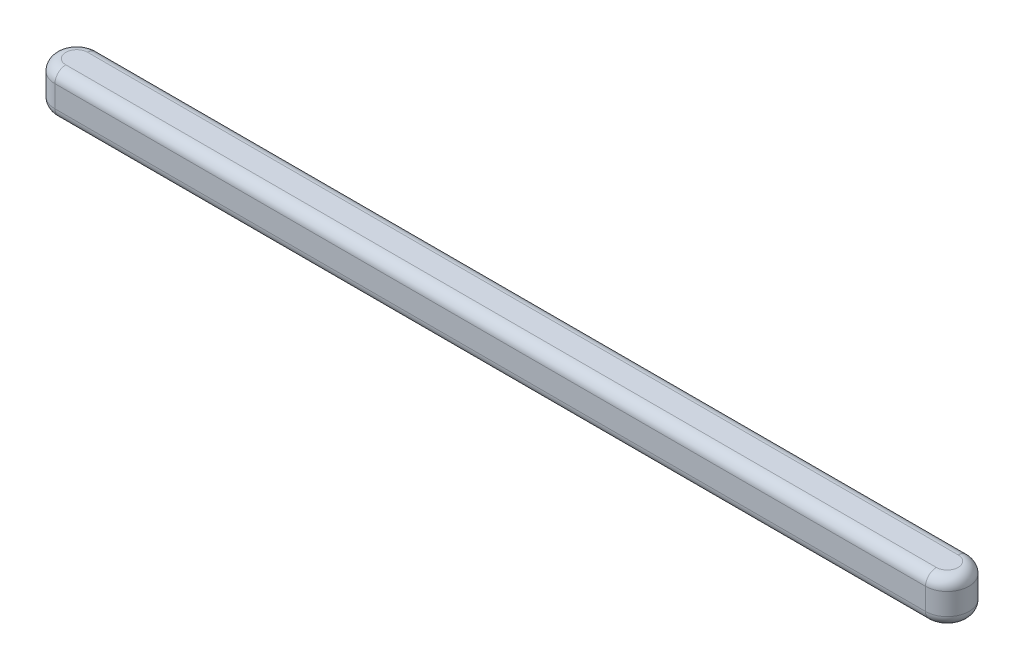
ISO-10303-21;
HEADER;
FILE_DESCRIPTION(('STEP AP214'),'2;1');
FILE_NAME('part.step','',(''),(''),'','','');
FILE_SCHEMA(('AUTOMOTIVE_DESIGN { 1 0 10303 214 1 1 1 1 }'));
ENDSEC;
DATA;
#1=APPLICATION_CONTEXT('core data for automotive mechanical design processes');
#2=APPLICATION_PROTOCOL_DEFINITION('international standard','automotive_design',2000,#1);
#3=PRODUCT_CONTEXT('',#1,'mechanical');
#4=PRODUCT('Part','Part','',(#3));
#5=PRODUCT_RELATED_PRODUCT_CATEGORY('part','',(#4));
#6=PRODUCT_DEFINITION_FORMATION('','',#4);
#7=PRODUCT_DEFINITION_CONTEXT('part definition',#1,'design');
#8=PRODUCT_DEFINITION('design','',#6,#7);
#9=PRODUCT_DEFINITION_SHAPE('','',#8);
#10=(LENGTH_UNIT() NAMED_UNIT(*) SI_UNIT(.MILLI.,.METRE.));
#11=(NAMED_UNIT(*) PLANE_ANGLE_UNIT() SI_UNIT($,.RADIAN.));
#12=(NAMED_UNIT(*) SI_UNIT($,.STERADIAN.) SOLID_ANGLE_UNIT());
#13=UNCERTAINTY_MEASURE_WITH_UNIT(LENGTH_MEASURE(1.E-05),#10,'distance_accuracy_value','');
#14=(GEOMETRIC_REPRESENTATION_CONTEXT(3) GLOBAL_UNCERTAINTY_ASSIGNED_CONTEXT((#13)) GLOBAL_UNIT_ASSIGNED_CONTEXT((#10,
#11,#12)) REPRESENTATION_CONTEXT('',''));
#15=CARTESIAN_POINT('',(0.,0.,0.));
#16=DIRECTION('',(0.,0.,1.));
#17=DIRECTION('',(1.,0.,0.));
#18=AXIS2_PLACEMENT_3D('',#15,#16,#17);
#19=CARTESIAN_POINT('',(0.,10.,0.));
#20=DIRECTION('',(0.,-1.,0.));
#21=DIRECTION('',(0.,0.,-1.));
#22=AXIS2_PLACEMENT_3D('',#19,#20,#21);
#23=CYLINDRICAL_SURFACE('',#22,5.);
#24=DIRECTION('',(0.,-1.,0.));
#25=VECTOR('',#24,1.);
#26=CARTESIAN_POINT('',(0.,10.,-5.));
#27=LINE('',#26,#25);
#28=CARTESIAN_POINT('',(0.,7.5,-5.));
#29=VERTEX_POINT('',#28);
#30=CARTESIAN_POINT('',(0.,2.5,-5.));
#31=VERTEX_POINT('',#30);
#32=EDGE_CURVE('E158',#29,#31,#27,.T.);
#33=ORIENTED_EDGE('',*,*,#32,.T.);
#34=CARTESIAN_POINT('',(0.,2.5,0.));
#35=DIRECTION('',(0.,1.,0.));
#36=DIRECTION('',(0.,0.,1.));
#37=AXIS2_PLACEMENT_3D('',#34,#35,#36);
#38=CIRCLE('',#37,5.);
#39=CARTESIAN_POINT('',(0.,2.5,5.));
#40=VERTEX_POINT('',#39);
#41=EDGE_CURVE('E172',#31,#40,#38,.T.);
#42=ORIENTED_EDGE('',*,*,#41,.T.);
#43=DIRECTION('',(0.,-1.,0.));
#44=VECTOR('',#43,1.);
#45=CARTESIAN_POINT('',(0.,10.,5.));
#46=LINE('',#45,#44);
#47=CARTESIAN_POINT('',(0.,7.5,5.));
#48=VERTEX_POINT('',#47);
#49=EDGE_CURVE('E129',#48,#40,#46,.T.);
#50=ORIENTED_EDGE('',*,*,#49,.F.);
#51=CARTESIAN_POINT('',(0.,7.5,0.));
#52=DIRECTION('',(0.,1.,0.));
#53=DIRECTION('',(0.,0.,1.));
#54=AXIS2_PLACEMENT_3D('',#51,#52,#53);
#55=CIRCLE('',#54,5.);
#56=EDGE_CURVE('E175',#48,#29,#55,.F.);
#57=ORIENTED_EDGE('',*,*,#56,.T.);
#58=EDGE_LOOP('',(#33,#42,#50,#57));
#59=FACE_BOUND('',#58,.T.);
#60=ADVANCED_FACE('F39',(#59),#23,.T.);
#61=CARTESIAN_POINT('',(0.,10.,5.));
#62=DIRECTION('',(0.,0.,-1.));
#63=DIRECTION('',(-1.,0.,0.));
#64=AXIS2_PLACEMENT_3D('',#61,#62,#63);
#65=PLANE('',#64);
#66=ORIENTED_EDGE('',*,*,#49,.T.);
#67=DIRECTION('',(1.,0.,0.));
#68=VECTOR('',#67,1.);
#69=CARTESIAN_POINT('',(0.,2.5,5.));
#70=LINE('',#69,#68);
#71=CARTESIAN_POINT('',(200.,2.5,5.));
#72=VERTEX_POINT('',#71);
#73=EDGE_CURVE('E127',#40,#72,#70,.T.);
#74=ORIENTED_EDGE('',*,*,#73,.T.);
#75=DIRECTION('',(0.,-1.,0.));
#76=VECTOR('',#75,1.);
#77=CARTESIAN_POINT('',(200.,10.,5.));
#78=LINE('',#77,#76);
#79=CARTESIAN_POINT('',(200.,7.5,5.));
#80=VERTEX_POINT('',#79);
#81=EDGE_CURVE('E109',#80,#72,#78,.T.);
#82=ORIENTED_EDGE('',*,*,#81,.F.);
#83=DIRECTION('',(1.,0.,0.));
#84=VECTOR('',#83,1.);
#85=CARTESIAN_POINT('',(0.,7.5,5.));
#86=LINE('',#85,#84);
#87=EDGE_CURVE('E124',#80,#48,#86,.F.);
#88=ORIENTED_EDGE('',*,*,#87,.T.);
#89=EDGE_LOOP('',(#66,#74,#82,#88));
#90=FACE_BOUND('',#89,.T.);
#91=ADVANCED_FACE('F123',(#90),#65,.F.);
#92=CARTESIAN_POINT('',(200.,10.,0.));
#93=DIRECTION('',(0.,-1.,0.));
#94=DIRECTION('',(0.,0.,-1.));
#95=AXIS2_PLACEMENT_3D('',#92,#93,#94);
#96=CYLINDRICAL_SURFACE('',#95,5.);
#97=ORIENTED_EDGE('',*,*,#81,.T.);
#98=CARTESIAN_POINT('',(200.,2.5,0.));
#99=DIRECTION('',(0.,1.,0.));
#100=DIRECTION('',(0.,0.,1.));
#101=AXIS2_PLACEMENT_3D('',#98,#99,#100);
#102=CIRCLE('',#101,5.);
#103=CARTESIAN_POINT('',(200.,2.5,-5.));
#104=VERTEX_POINT('',#103);
#105=EDGE_CURVE('E116',#72,#104,#102,.T.);
#106=ORIENTED_EDGE('',*,*,#105,.T.);
#107=DIRECTION('',(0.,-1.,0.));
#108=VECTOR('',#107,1.);
#109=CARTESIAN_POINT('',(200.,10.,-5.));
#110=LINE('',#109,#108);
#111=CARTESIAN_POINT('',(200.,7.5,-5.));
#112=VERTEX_POINT('',#111);
#113=EDGE_CURVE('E111',#112,#104,#110,.T.);
#114=ORIENTED_EDGE('',*,*,#113,.F.);
#115=CARTESIAN_POINT('',(200.,7.5,0.));
#116=DIRECTION('',(0.,1.,0.));
#117=DIRECTION('',(0.,0.,1.));
#118=AXIS2_PLACEMENT_3D('',#115,#116,#117);
#119=CIRCLE('',#118,5.);
#120=EDGE_CURVE('E106',#112,#80,#119,.F.);
#121=ORIENTED_EDGE('',*,*,#120,.T.);
#122=EDGE_LOOP('',(#97,#106,#114,#121));
#123=FACE_BOUND('',#122,.T.);
#124=ADVANCED_FACE('F108',(#123),#96,.T.);
#125=CARTESIAN_POINT('',(0.,10.,-5.));
#126=DIRECTION('',(0.,0.,1.));
#127=DIRECTION('',(1.,0.,0.));
#128=AXIS2_PLACEMENT_3D('',#125,#126,#127);
#129=PLANE('',#128);
#130=ORIENTED_EDGE('',*,*,#113,.T.);
#131=DIRECTION('',(-1.,0.,0.));
#132=VECTOR('',#131,1.);
#133=CARTESIAN_POINT('',(0.,2.5,-5.));
#134=LINE('',#133,#132);
#135=EDGE_CURVE('E178',#104,#31,#134,.T.);
#136=ORIENTED_EDGE('',*,*,#135,.T.);
#137=ORIENTED_EDGE('',*,*,#32,.F.);
#138=DIRECTION('',(-1.,0.,0.));
#139=VECTOR('',#138,1.);
#140=CARTESIAN_POINT('',(200.,7.5,-5.));
#141=LINE('',#140,#139);
#142=EDGE_CURVE('E181',#29,#112,#141,.F.);
#143=ORIENTED_EDGE('',*,*,#142,.T.);
#144=EDGE_LOOP('',(#130,#136,#137,#143));
#145=FACE_BOUND('',#144,.T.);
#146=ADVANCED_FACE('F229',(#145),#129,.F.);
#147=CARTESIAN_POINT('',(0.,10.,0.));
#148=DIRECTION('',(0.,1.,0.));
#149=DIRECTION('',(0.,0.,1.));
#150=AXIS2_PLACEMENT_3D('',#147,#148,#149);
#151=PLANE('',#150);
#152=CARTESIAN_POINT('',(200.,10.,0.));
#153=DIRECTION('',(0.,1.,0.));
#154=DIRECTION('',(0.,0.,1.));
#155=AXIS2_PLACEMENT_3D('',#152,#153,#154);
#156=CIRCLE('',#155,2.5);
#157=CARTESIAN_POINT('',(200.,10.,2.5));
#158=VERTEX_POINT('',#157);
#159=CARTESIAN_POINT('',(200.,10.,-2.5));
#160=VERTEX_POINT('',#159);
#161=EDGE_CURVE('E49',#158,#160,#156,.T.);
#162=ORIENTED_EDGE('',*,*,#161,.T.);
#163=DIRECTION('',(-1.,0.,0.));
#164=VECTOR('',#163,1.);
#165=CARTESIAN_POINT('',(0.,10.,-2.5));
#166=LINE('',#165,#164);
#167=CARTESIAN_POINT('',(0.,10.,-2.5));
#168=VERTEX_POINT('',#167);
#169=EDGE_CURVE('E11',#160,#168,#166,.T.);
#170=ORIENTED_EDGE('',*,*,#169,.T.);
#171=CARTESIAN_POINT('',(0.,10.,0.));
#172=DIRECTION('',(0.,1.,0.));
#173=DIRECTION('',(0.,0.,1.));
#174=AXIS2_PLACEMENT_3D('',#171,#172,#173);
#175=CIRCLE('',#174,2.5);
#176=CARTESIAN_POINT('',(0.,10.,2.5));
#177=VERTEX_POINT('',#176);
#178=EDGE_CURVE('E169',#168,#177,#175,.T.);
#179=ORIENTED_EDGE('',*,*,#178,.T.);
#180=DIRECTION('',(1.,0.,0.));
#181=VECTOR('',#180,1.);
#182=CARTESIAN_POINT('',(200.,10.,2.5));
#183=LINE('',#182,#181);
#184=EDGE_CURVE('E60',#177,#158,#183,.T.);
#185=ORIENTED_EDGE('',*,*,#184,.T.);
#186=EDGE_LOOP('',(#162,#170,#179,#185));
#187=FACE_BOUND('',#186,.T.);
#188=ADVANCED_FACE('F235',(#187),#151,.T.);
#189=CARTESIAN_POINT('',(0.,0.,0.));
#190=DIRECTION('',(0.,1.,0.));
#191=DIRECTION('',(0.,0.,1.));
#192=AXIS2_PLACEMENT_3D('',#189,#190,#191);
#193=PLANE('',#192);
#194=CARTESIAN_POINT('',(200.,0.,0.));
#195=DIRECTION('',(0.,1.,0.));
#196=DIRECTION('',(0.,0.,1.));
#197=AXIS2_PLACEMENT_3D('',#194,#195,#196);
#198=CIRCLE('',#197,2.5);
#199=CARTESIAN_POINT('',(200.,0.,-2.5));
#200=VERTEX_POINT('',#199);
#201=CARTESIAN_POINT('',(200.,0.,2.5));
#202=VERTEX_POINT('',#201);
#203=EDGE_CURVE('E189',#200,#202,#198,.F.);
#204=ORIENTED_EDGE('',*,*,#203,.T.);
#205=DIRECTION('',(1.,0.,0.));
#206=VECTOR('',#205,1.);
#207=CARTESIAN_POINT('',(0.,0.,2.5));
#208=LINE('',#207,#206);
#209=CARTESIAN_POINT('',(0.,0.,2.5));
#210=VERTEX_POINT('',#209);
#211=EDGE_CURVE('E117',#202,#210,#208,.F.);
#212=ORIENTED_EDGE('',*,*,#211,.T.);
#213=CARTESIAN_POINT('',(0.,0.,0.));
#214=DIRECTION('',(0.,1.,0.));
#215=DIRECTION('',(0.,0.,1.));
#216=AXIS2_PLACEMENT_3D('',#213,#214,#215);
#217=CIRCLE('',#216,2.5);
#218=CARTESIAN_POINT('',(0.,0.,-2.5));
#219=VERTEX_POINT('',#218);
#220=EDGE_CURVE('E195',#210,#219,#217,.F.);
#221=ORIENTED_EDGE('',*,*,#220,.T.);
#222=DIRECTION('',(-1.,0.,0.));
#223=VECTOR('',#222,1.);
#224=CARTESIAN_POINT('',(0.,0.,-2.5));
#225=LINE('',#224,#223);
#226=EDGE_CURVE('E192',#219,#200,#225,.F.);
#227=ORIENTED_EDGE('',*,*,#226,.T.);
#228=EDGE_LOOP('',(#204,#212,#221,#227));
#229=FACE_BOUND('',#228,.T.);
#230=ADVANCED_FACE('F237',(#229),#193,.F.);
#231=CARTESIAN_POINT('',(0.,2.5,-2.5));
#232=DIRECTION('',(-1.,0.,0.));
#233=DIRECTION('',(0.,0.,1.));
#234=AXIS2_PLACEMENT_3D('',#231,#232,#233);
#235=CYLINDRICAL_SURFACE('',#234,2.5);
#236=CARTESIAN_POINT('',(200.,2.5,-2.5));
#237=DIRECTION('',(1.,0.,0.));
#238=DIRECTION('',(0.,0.,-1.));
#239=AXIS2_PLACEMENT_3D('',#236,#237,#238);
#240=CIRCLE('',#239,2.5);
#241=EDGE_CURVE('E159',#200,#104,#240,.T.);
#242=ORIENTED_EDGE('',*,*,#241,.F.);
#243=ORIENTED_EDGE('',*,*,#226,.F.);
#244=CARTESIAN_POINT('',(0.,2.5,-2.5));
#245=DIRECTION('',(-1.,0.,0.));
#246=DIRECTION('',(0.,0.,1.));
#247=AXIS2_PLACEMENT_3D('',#244,#245,#246);
#248=CIRCLE('',#247,2.5);
#249=EDGE_CURVE('E154',#31,#219,#248,.T.);
#250=ORIENTED_EDGE('',*,*,#249,.F.);
#251=ORIENTED_EDGE('',*,*,#135,.F.);
#252=EDGE_LOOP('',(#242,#243,#250,#251));
#253=FACE_BOUND('',#252,.T.);
#254=ADVANCED_FACE('F216',(#253),#235,.T.);
#255=CARTESIAN_POINT('',(0.,2.5,0.));
#256=DIRECTION('',(0.,1.,0.));
#257=DIRECTION('',(0.,0.,1.));
#258=AXIS2_PLACEMENT_3D('',#255,#256,#257);
#259=DEGENERATE_TOROIDAL_SURFACE('',#258,2.5,2.5,.T.);
#260=ORIENTED_EDGE('',*,*,#249,.T.);
#261=ORIENTED_EDGE('',*,*,#220,.F.);
#262=CARTESIAN_POINT('',(0.,2.5,2.5));
#263=DIRECTION('',(1.,0.,0.));
#264=DIRECTION('',(0.,0.,-1.));
#265=AXIS2_PLACEMENT_3D('',#262,#263,#264);
#266=CIRCLE('',#265,2.5);
#267=EDGE_CURVE('E143',#40,#210,#266,.T.);
#268=ORIENTED_EDGE('',*,*,#267,.F.);
#269=ORIENTED_EDGE('',*,*,#41,.F.);
#270=EDGE_LOOP('',(#260,#261,#268,#269));
#271=FACE_BOUND('',#270,.T.);
#272=ADVANCED_FACE('F220',(#271),#259,.T.);
#273=CARTESIAN_POINT('',(200.,2.5,0.));
#274=DIRECTION('',(0.,1.,0.));
#275=DIRECTION('',(0.,0.,1.));
#276=AXIS2_PLACEMENT_3D('',#273,#274,#275);
#277=DEGENERATE_TOROIDAL_SURFACE('',#276,2.5,2.5,.T.);
#278=ORIENTED_EDGE('',*,*,#241,.T.);
#279=ORIENTED_EDGE('',*,*,#105,.F.);
#280=CARTESIAN_POINT('',(200.,2.5,2.5));
#281=DIRECTION('',(-1.,0.,0.));
#282=DIRECTION('',(0.,0.,1.));
#283=AXIS2_PLACEMENT_3D('',#280,#281,#282);
#284=CIRCLE('',#283,2.5);
#285=EDGE_CURVE('E140',#202,#72,#284,.T.);
#286=ORIENTED_EDGE('',*,*,#285,.F.);
#287=ORIENTED_EDGE('',*,*,#203,.F.);
#288=EDGE_LOOP('',(#278,#279,#286,#287));
#289=FACE_BOUND('',#288,.T.);
#290=ADVANCED_FACE('F228',(#289),#277,.T.);
#291=CARTESIAN_POINT('',(0.,2.5,2.5));
#292=DIRECTION('',(1.,0.,0.));
#293=DIRECTION('',(0.,0.,-1.));
#294=AXIS2_PLACEMENT_3D('',#291,#292,#293);
#295=CYLINDRICAL_SURFACE('',#294,2.5);
#296=ORIENTED_EDGE('',*,*,#267,.T.);
#297=ORIENTED_EDGE('',*,*,#211,.F.);
#298=ORIENTED_EDGE('',*,*,#285,.T.);
#299=ORIENTED_EDGE('',*,*,#73,.F.);
#300=EDGE_LOOP('',(#296,#297,#298,#299));
#301=FACE_BOUND('',#300,.T.);
#302=ADVANCED_FACE('F223',(#301),#295,.T.);
#303=CARTESIAN_POINT('',(0.,7.5,2.5));
#304=DIRECTION('',(-1.,0.,0.));
#305=DIRECTION('',(0.,0.,1.));
#306=AXIS2_PLACEMENT_3D('',#303,#304,#305);
#307=CYLINDRICAL_SURFACE('',#306,2.5);
#308=CARTESIAN_POINT('',(0.,7.5,2.5));
#309=DIRECTION('',(-1.,0.,0.));
#310=DIRECTION('',(0.,0.,1.));
#311=AXIS2_PLACEMENT_3D('',#308,#309,#310);
#312=CIRCLE('',#311,2.5);
#313=EDGE_CURVE('E134',#48,#177,#312,.T.);
#314=ORIENTED_EDGE('',*,*,#313,.F.);
#315=ORIENTED_EDGE('',*,*,#87,.F.);
#316=CARTESIAN_POINT('',(200.,7.5,2.5));
#317=DIRECTION('',(1.,0.,0.));
#318=DIRECTION('',(0.,0.,-1.));
#319=AXIS2_PLACEMENT_3D('',#316,#317,#318);
#320=CIRCLE('',#319,2.5);
#321=EDGE_CURVE('E43',#158,#80,#320,.T.);
#322=ORIENTED_EDGE('',*,*,#321,.F.);
#323=ORIENTED_EDGE('',*,*,#184,.F.);
#324=EDGE_LOOP('',(#314,#315,#322,#323));
#325=FACE_BOUND('',#324,.T.);
#326=ADVANCED_FACE('F41',(#325),#307,.T.);
#327=CARTESIAN_POINT('',(200.,7.5,0.));
#328=DIRECTION('',(0.,1.,0.));
#329=DIRECTION('',(0.,0.,1.));
#330=AXIS2_PLACEMENT_3D('',#327,#328,#329);
#331=DEGENERATE_TOROIDAL_SURFACE('',#330,2.5,2.5,.T.);
#332=ORIENTED_EDGE('',*,*,#321,.T.);
#333=ORIENTED_EDGE('',*,*,#120,.F.);
#334=CARTESIAN_POINT('',(200.,7.5,-2.5));
#335=DIRECTION('',(-1.,0.,0.));
#336=DIRECTION('',(0.,0.,1.));
#337=AXIS2_PLACEMENT_3D('',#334,#335,#336);
#338=CIRCLE('',#337,2.5);
#339=EDGE_CURVE('E145',#160,#112,#338,.T.);
#340=ORIENTED_EDGE('',*,*,#339,.F.);
#341=ORIENTED_EDGE('',*,*,#161,.F.);
#342=EDGE_LOOP('',(#332,#333,#340,#341));
#343=FACE_BOUND('',#342,.T.);
#344=ADVANCED_FACE('F138',(#343),#331,.T.);
#345=CARTESIAN_POINT('',(0.,7.5,0.));
#346=DIRECTION('',(0.,1.,0.));
#347=DIRECTION('',(0.,0.,1.));
#348=AXIS2_PLACEMENT_3D('',#345,#346,#347);
#349=DEGENERATE_TOROIDAL_SURFACE('',#348,2.5,2.5,.T.);
#350=ORIENTED_EDGE('',*,*,#313,.T.);
#351=ORIENTED_EDGE('',*,*,#178,.F.);
#352=CARTESIAN_POINT('',(0.,7.5,-2.5));
#353=DIRECTION('',(1.,0.,0.));
#354=DIRECTION('',(0.,0.,-1.));
#355=AXIS2_PLACEMENT_3D('',#352,#353,#354);
#356=CIRCLE('',#355,2.5);
#357=EDGE_CURVE('E149',#29,#168,#356,.T.);
#358=ORIENTED_EDGE('',*,*,#357,.F.);
#359=ORIENTED_EDGE('',*,*,#56,.F.);
#360=EDGE_LOOP('',(#350,#351,#358,#359));
#361=FACE_BOUND('',#360,.T.);
#362=ADVANCED_FACE('F234',(#361),#349,.T.);
#363=CARTESIAN_POINT('',(0.,7.5,-2.5));
#364=DIRECTION('',(1.,0.,0.));
#365=DIRECTION('',(0.,0.,-1.));
#366=AXIS2_PLACEMENT_3D('',#363,#364,#365);
#367=CYLINDRICAL_SURFACE('',#366,2.5);
#368=ORIENTED_EDGE('',*,*,#339,.T.);
#369=ORIENTED_EDGE('',*,*,#142,.F.);
#370=ORIENTED_EDGE('',*,*,#357,.T.);
#371=ORIENTED_EDGE('',*,*,#169,.F.);
#372=EDGE_LOOP('',(#368,#369,#370,#371));
#373=FACE_BOUND('',#372,.T.);
#374=ADVANCED_FACE('F232',(#373),#367,.T.);
#375=CLOSED_SHELL('',(#60,#91,#124,#146,#188,#230,#254,#272,#290,#302,#326,#344,#362,#374));
#376=MANIFOLD_SOLID_BREP('B2',#375);
#377=ADVANCED_BREP_SHAPE_REPRESENTATION('',(#18,#376),#14);
#378=SHAPE_DEFINITION_REPRESENTATION(#9,#377);
ENDSEC;
END-ISO-10303-21;
